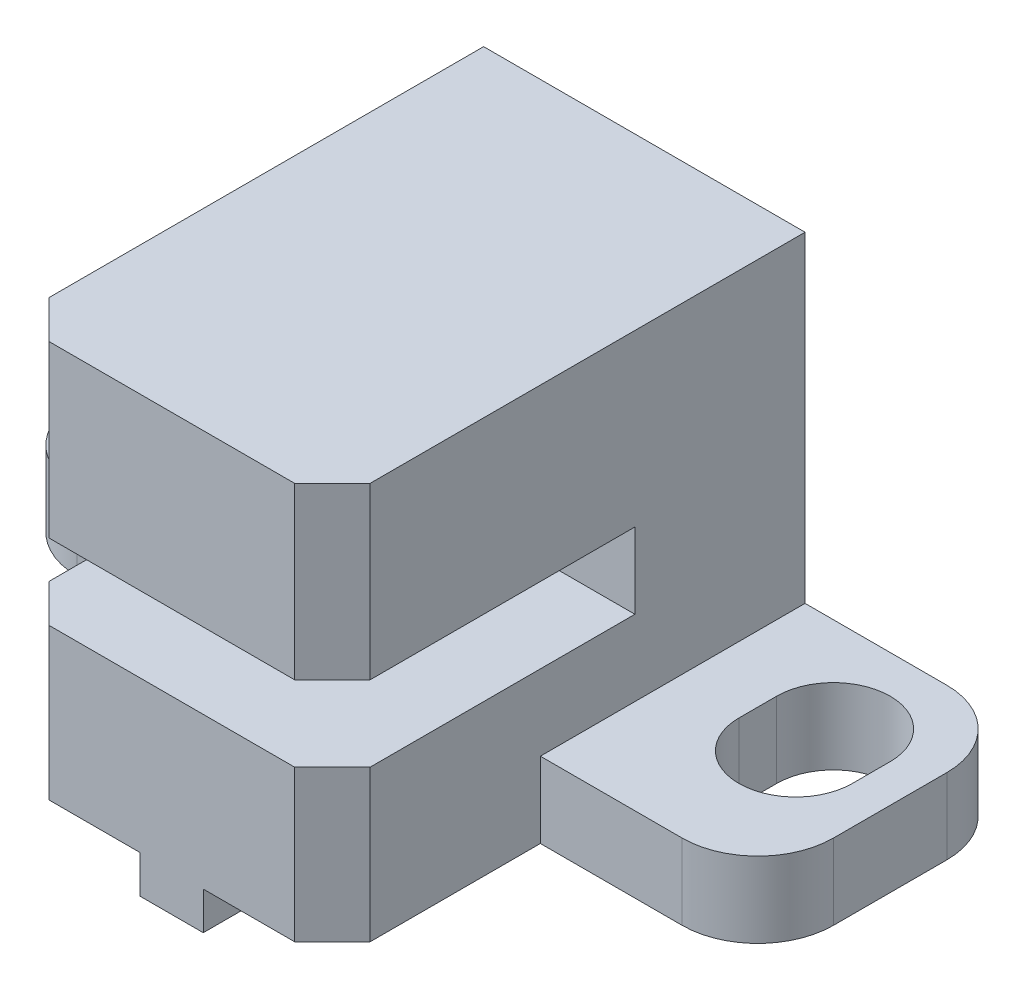
ISO-10303-21;
HEADER;
FILE_DESCRIPTION(('STEP AP214'),'2;1');
FILE_NAME('part.step','',(''),(''),'','','');
FILE_SCHEMA(('AUTOMOTIVE_DESIGN { 1 0 10303 214 1 1 1 1 }'));
ENDSEC;
DATA;
#1=APPLICATION_CONTEXT('core data for automotive mechanical design processes');
#2=APPLICATION_PROTOCOL_DEFINITION('international standard','automotive_design',2000,#1);
#3=PRODUCT_CONTEXT('',#1,'mechanical');
#4=PRODUCT('Part','Part','',(#3));
#5=PRODUCT_RELATED_PRODUCT_CATEGORY('part','',(#4));
#6=PRODUCT_DEFINITION_FORMATION('','',#4);
#7=PRODUCT_DEFINITION_CONTEXT('part definition',#1,'design');
#8=PRODUCT_DEFINITION('design','',#6,#7);
#9=PRODUCT_DEFINITION_SHAPE('','',#8);
#10=(LENGTH_UNIT() NAMED_UNIT(*) SI_UNIT(.MILLI.,.METRE.));
#11=(NAMED_UNIT(*) PLANE_ANGLE_UNIT() SI_UNIT($,.RADIAN.));
#12=(NAMED_UNIT(*) SI_UNIT($,.STERADIAN.) SOLID_ANGLE_UNIT());
#13=UNCERTAINTY_MEASURE_WITH_UNIT(LENGTH_MEASURE(1.E-05),#10,'distance_accuracy_value','');
#14=(GEOMETRIC_REPRESENTATION_CONTEXT(3) GLOBAL_UNCERTAINTY_ASSIGNED_CONTEXT((#13)) GLOBAL_UNIT_ASSIGNED_CONTEXT((#10,
#11,#12)) REPRESENTATION_CONTEXT('',''));
#15=CARTESIAN_POINT('',(0.,0.,0.));
#16=DIRECTION('',(0.,0.,1.));
#17=DIRECTION('',(1.,0.,0.));
#18=AXIS2_PLACEMENT_3D('',#15,#16,#17);
#19=CARTESIAN_POINT('',(-4.25,-5.25,12.5));
#20=DIRECTION('',(0.,1.,0.));
#21=DIRECTION('',(0.,0.,1.));
#22=AXIS2_PLACEMENT_3D('',#19,#20,#21);
#23=PLANE('',#22);
#24=DIRECTION('',(0.,0.,1.));
#25=VECTOR('',#24,1.);
#26=CARTESIAN_POINT('',(9.,-5.25,2.5));
#27=LINE('',#26,#25);
#28=CARTESIAN_POINT('',(9.,-5.25,2.5));
#29=VERTEX_POINT('',#28);
#30=CARTESIAN_POINT('',(9.,-5.25,3.5));
#31=VERTEX_POINT('',#30);
#32=EDGE_CURVE('E412',#29,#31,#27,.T.);
#33=ORIENTED_EDGE('',*,*,#32,.F.);
#34=CARTESIAN_POINT('',(7.5,-5.25,2.5));
#35=DIRECTION('',(0.,-1.,0.));
#36=DIRECTION('',(0.,0.,-1.));
#37=AXIS2_PLACEMENT_3D('',#34,#35,#36);
#38=CIRCLE('',#37,1.5);
#39=CARTESIAN_POINT('',(6.,-5.25,2.5));
#40=VERTEX_POINT('',#39);
#41=EDGE_CURVE('E379',#40,#29,#38,.T.);
#42=ORIENTED_EDGE('',*,*,#41,.F.);
#43=DIRECTION('',(0.,0.,-1.));
#44=VECTOR('',#43,1.);
#45=CARTESIAN_POINT('',(6.,-5.25,2.5));
#46=LINE('',#45,#44);
#47=CARTESIAN_POINT('',(6.,-5.25,3.5));
#48=VERTEX_POINT('',#47);
#49=EDGE_CURVE('E397',#48,#40,#46,.T.);
#50=ORIENTED_EDGE('',*,*,#49,.F.);
#51=CARTESIAN_POINT('',(7.5,-5.25,3.5));
#52=DIRECTION('',(0.,-1.,0.));
#53=DIRECTION('',(0.,0.,-1.));
#54=AXIS2_PLACEMENT_3D('',#51,#52,#53);
#55=CIRCLE('',#54,1.5);
#56=EDGE_CURVE('E416',#31,#48,#55,.T.);
#57=ORIENTED_EDGE('',*,*,#56,.F.);
#58=EDGE_LOOP('',(#33,#42,#50,#57));
#59=FACE_BOUND('',#58,.T.);
#60=DIRECTION('',(0.,0.,1.));
#61=VECTOR('',#60,1.);
#62=CARTESIAN_POINT('',(0.835960491836318,-5.25,0.));
#63=LINE('',#62,#61);
#64=CARTESIAN_POINT('',(0.835960491836318,-5.25,0.));
#65=VERTEX_POINT('',#64);
#66=CARTESIAN_POINT('',(0.835960491836318,-5.25,12.5));
#67=VERTEX_POINT('',#66);
#68=EDGE_CURVE('E55',#65,#67,#63,.T.);
#69=ORIENTED_EDGE('',*,*,#68,.F.);
#70=DIRECTION('',(1.,0.,0.));
#71=VECTOR('',#70,1.);
#72=CARTESIAN_POINT('',(-4.25,-5.25,0.));
#73=LINE('',#72,#71);
#74=CARTESIAN_POINT('',(7.99999999999999,-5.25,0.));
#75=VERTEX_POINT('',#74);
#76=EDGE_CURVE('E552',#65,#75,#73,.T.);
#77=ORIENTED_EDGE('',*,*,#76,.T.);
#78=CARTESIAN_POINT('',(8.,-5.25,2.));
#79=DIRECTION('',(0.,-1.,0.));
#80=DIRECTION('',(0.,0.,1.));
#81=AXIS2_PLACEMENT_3D('',#78,#79,#80);
#82=CIRCLE('',#81,2.);
#83=CARTESIAN_POINT('',(10.,-5.25,2.00000000000001));
#84=VERTEX_POINT('',#83);
#85=EDGE_CURVE('E426',#75,#84,#82,.T.);
#86=ORIENTED_EDGE('',*,*,#85,.T.);
#87=DIRECTION('',(0.,0.,1.));
#88=VECTOR('',#87,1.);
#89=CARTESIAN_POINT('',(10.,-5.25,2.00000000000001));
#90=LINE('',#89,#88);
#91=CARTESIAN_POINT('',(10.,-5.25,4.99999999999999));
#92=VERTEX_POINT('',#91);
#93=EDGE_CURVE('E465',#84,#92,#90,.T.);
#94=ORIENTED_EDGE('',*,*,#93,.T.);
#95=CARTESIAN_POINT('',(8.,-5.25,5.));
#96=DIRECTION('',(0.,-1.,0.));
#97=DIRECTION('',(0.,0.,1.));
#98=AXIS2_PLACEMENT_3D('',#95,#96,#97);
#99=CIRCLE('',#98,2.);
#100=CARTESIAN_POINT('',(7.99999999999999,-5.25,7.));
#101=VERTEX_POINT('',#100);
#102=EDGE_CURVE('E469',#92,#101,#99,.T.);
#103=ORIENTED_EDGE('',*,*,#102,.T.);
#104=DIRECTION('',(-1.,0.,0.));
#105=VECTOR('',#104,1.);
#106=CARTESIAN_POINT('',(4.25,-5.25,7.));
#107=LINE('',#106,#105);
#108=CARTESIAN_POINT('',(4.25,-5.25,7.));
#109=VERTEX_POINT('',#108);
#110=EDGE_CURVE('E441',#101,#109,#107,.T.);
#111=ORIENTED_EDGE('',*,*,#110,.T.);
#112=DIRECTION('',(0.,0.,-1.));
#113=VECTOR('',#112,1.);
#114=CARTESIAN_POINT('',(4.25,-5.25,12.5));
#115=LINE('',#114,#113);
#116=CARTESIAN_POINT('',(4.25,-5.25,11.5));
#117=VERTEX_POINT('',#116);
#118=EDGE_CURVE('E540',#117,#109,#115,.T.);
#119=ORIENTED_EDGE('',*,*,#118,.F.);
#120=DIRECTION('',(-0.707106781186546,0.,0.707106781186549));
#121=VECTOR('',#120,1.);
#122=CARTESIAN_POINT('',(3.25,-5.25,12.5));
#123=LINE('',#122,#121);
#124=CARTESIAN_POINT('',(3.25000000000001,-5.25,12.5));
#125=VERTEX_POINT('',#124);
#126=EDGE_CURVE('E589',#117,#125,#123,.T.);
#127=ORIENTED_EDGE('',*,*,#126,.T.);
#128=DIRECTION('',(1.,0.,0.));
#129=VECTOR('',#128,1.);
#130=CARTESIAN_POINT('',(-4.25,-5.25,12.5));
#131=LINE('',#130,#129);
#132=EDGE_CURVE('E60',#67,#125,#131,.T.);
#133=ORIENTED_EDGE('',*,*,#132,.F.);
#134=EDGE_LOOP('',(#69,#77,#86,#94,#103,#111,#119,#127,#133));
#135=FACE_BOUND('',#134,.T.);
#136=ADVANCED_FACE('F39',(#59,#135),#23,.F.);
#137=CARTESIAN_POINT('',(-7.5,-5.25,2.5));
#138=DIRECTION('',(0.,-1.,0.));
#139=DIRECTION('',(0.,0.,1.));
#140=AXIS2_PLACEMENT_3D('',#137,#138,#139);
#141=CIRCLE('',#140,1.5);
#142=CARTESIAN_POINT('',(-9.,-5.25,2.5));
#143=VERTEX_POINT('',#142);
#144=CARTESIAN_POINT('',(-6.,-5.25,2.5));
#145=VERTEX_POINT('',#144);
#146=EDGE_CURVE('E284',#143,#145,#141,.T.);
#147=ORIENTED_EDGE('',*,*,#146,.F.);
#148=DIRECTION('',(0.,0.,-1.));
#149=VECTOR('',#148,1.);
#150=CARTESIAN_POINT('',(-9.,-5.25,2.5));
#151=LINE('',#150,#149);
#152=CARTESIAN_POINT('',(-9.,-5.25,3.5));
#153=VERTEX_POINT('',#152);
#154=EDGE_CURVE('E299',#153,#143,#151,.T.);
#155=ORIENTED_EDGE('',*,*,#154,.F.);
#156=CARTESIAN_POINT('',(-7.5,-5.25,3.5));
#157=DIRECTION('',(0.,-1.,0.));
#158=DIRECTION('',(0.,0.,1.));
#159=AXIS2_PLACEMENT_3D('',#156,#157,#158);
#160=CIRCLE('',#159,1.5);
#161=CARTESIAN_POINT('',(-6.,-5.25,3.5));
#162=VERTEX_POINT('',#161);
#163=EDGE_CURVE('E315',#162,#153,#160,.T.);
#164=ORIENTED_EDGE('',*,*,#163,.F.);
#165=DIRECTION('',(0.,0.,1.));
#166=VECTOR('',#165,1.);
#167=CARTESIAN_POINT('',(-6.,-5.25,2.5));
#168=LINE('',#167,#166);
#169=EDGE_CURVE('E288',#145,#162,#168,.T.);
#170=ORIENTED_EDGE('',*,*,#169,.F.);
#171=EDGE_LOOP('',(#147,#155,#164,#170));
#172=FACE_BOUND('',#171,.T.);
#173=DIRECTION('',(0.,0.,-1.));
#174=VECTOR('',#173,1.);
#175=CARTESIAN_POINT('',(-0.835960491836315,-5.25,0.));
#176=LINE('',#175,#174);
#177=CARTESIAN_POINT('',(-0.835960491836315,-5.25,12.5));
#178=VERTEX_POINT('',#177);
#179=CARTESIAN_POINT('',(-0.835960491836315,-5.25,0.));
#180=VERTEX_POINT('',#179);
#181=EDGE_CURVE('E280',#178,#180,#176,.T.);
#182=ORIENTED_EDGE('',*,*,#181,.F.);
#183=CARTESIAN_POINT('',(-3.25,-5.25,12.5));
#184=VERTEX_POINT('',#183);
#185=EDGE_CURVE('E537',#184,#178,#131,.T.);
#186=ORIENTED_EDGE('',*,*,#185,.F.);
#187=DIRECTION('',(-0.707106781186546,0.,-0.707106781186549));
#188=VECTOR('',#187,1.);
#189=CARTESIAN_POINT('',(-3.25,-5.25,12.5));
#190=LINE('',#189,#188);
#191=CARTESIAN_POINT('',(-4.25,-5.25,11.5));
#192=VERTEX_POINT('',#191);
#193=EDGE_CURVE('E586',#184,#192,#190,.T.);
#194=ORIENTED_EDGE('',*,*,#193,.T.);
#195=DIRECTION('',(0.,0.,-1.));
#196=VECTOR('',#195,1.);
#197=CARTESIAN_POINT('',(-4.25,-5.25,12.5));
#198=LINE('',#197,#196);
#199=CARTESIAN_POINT('',(-4.25,-5.25,7.));
#200=VERTEX_POINT('',#199);
#201=EDGE_CURVE('E557',#192,#200,#198,.T.);
#202=ORIENTED_EDGE('',*,*,#201,.T.);
#203=DIRECTION('',(-1.,0.,0.));
#204=VECTOR('',#203,1.);
#205=CARTESIAN_POINT('',(-4.25,-5.25,7.));
#206=LINE('',#205,#204);
#207=CARTESIAN_POINT('',(-7.99999999999998,-5.25,7.));
#208=VERTEX_POINT('',#207);
#209=EDGE_CURVE('E325',#200,#208,#206,.T.);
#210=ORIENTED_EDGE('',*,*,#209,.T.);
#211=CARTESIAN_POINT('',(-8.,-5.25,5.));
#212=DIRECTION('',(0.,-1.,0.));
#213=DIRECTION('',(0.,0.,-1.));
#214=AXIS2_PLACEMENT_3D('',#211,#212,#213);
#215=CIRCLE('',#214,2.);
#216=CARTESIAN_POINT('',(-10.,-5.25,4.99999999999999));
#217=VERTEX_POINT('',#216);
#218=EDGE_CURVE('E364',#208,#217,#215,.T.);
#219=ORIENTED_EDGE('',*,*,#218,.T.);
#220=DIRECTION('',(0.,0.,-1.));
#221=VECTOR('',#220,1.);
#222=CARTESIAN_POINT('',(-10.,-5.25,2.00000000000001));
#223=LINE('',#222,#221);
#224=CARTESIAN_POINT('',(-10.,-5.25,2.00000000000001));
#225=VERTEX_POINT('',#224);
#226=EDGE_CURVE('E368',#217,#225,#223,.T.);
#227=ORIENTED_EDGE('',*,*,#226,.T.);
#228=CARTESIAN_POINT('',(-8.,-5.25,2.));
#229=DIRECTION('',(0.,-1.,0.));
#230=DIRECTION('',(0.,0.,1.));
#231=AXIS2_PLACEMENT_3D('',#228,#229,#230);
#232=CIRCLE('',#231,2.);
#233=CARTESIAN_POINT('',(-7.99999999999998,-5.25,0.));
#234=VERTEX_POINT('',#233);
#235=EDGE_CURVE('E340',#225,#234,#232,.T.);
#236=ORIENTED_EDGE('',*,*,#235,.T.);
#237=EDGE_CURVE('E536',#234,#180,#73,.T.);
#238=ORIENTED_EDGE('',*,*,#237,.T.);
#239=EDGE_LOOP('',(#182,#186,#194,#202,#210,#219,#227,#236,#238));
#240=FACE_BOUND('',#239,.T.);
#241=ADVANCED_FACE('F657',(#172,#240),#23,.F.);
#242=CARTESIAN_POINT('',(4.25,5.25,12.5));
#243=DIRECTION('',(-1.,0.,0.));
#244=DIRECTION('',(0.,-1.,0.));
#245=AXIS2_PLACEMENT_3D('',#242,#243,#244);
#246=PLANE('',#245);
#247=DIRECTION('',(0.,0.,1.));
#248=VECTOR('',#247,1.);
#249=CARTESIAN_POINT('',(4.25,-1.25,4.5));
#250=LINE('',#249,#248);
#251=CARTESIAN_POINT('',(4.25,-1.25,4.5));
#252=VERTEX_POINT('',#251);
#253=CARTESIAN_POINT('',(4.25,-1.25,11.5));
#254=VERTEX_POINT('',#253);
#255=EDGE_CURVE('E525',#252,#254,#250,.T.);
#256=ORIENTED_EDGE('',*,*,#255,.T.);
#257=DIRECTION('',(0.,-1.,0.));
#258=VECTOR('',#257,1.);
#259=CARTESIAN_POINT('',(4.25,-5.25,11.5));
#260=LINE('',#259,#258);
#261=EDGE_CURVE('E583',#254,#117,#260,.T.);
#262=ORIENTED_EDGE('',*,*,#261,.T.);
#263=ORIENTED_EDGE('',*,*,#118,.T.);
#264=DIRECTION('',(0.,-1.,0.));
#265=VECTOR('',#264,1.);
#266=CARTESIAN_POINT('',(4.25,-3.25,7.));
#267=LINE('',#266,#265);
#268=CARTESIAN_POINT('',(4.25,-3.25,7.));
#269=VERTEX_POINT('',#268);
#270=EDGE_CURVE('E476',#269,#109,#267,.T.);
#271=ORIENTED_EDGE('',*,*,#270,.F.);
#272=DIRECTION('',(0.,0.,-1.));
#273=VECTOR('',#272,1.);
#274=CARTESIAN_POINT('',(4.25,-3.25,0.));
#275=LINE('',#274,#273);
#276=CARTESIAN_POINT('',(4.25,-3.25,0.));
#277=VERTEX_POINT('',#276);
#278=EDGE_CURVE('E436',#269,#277,#275,.T.);
#279=ORIENTED_EDGE('',*,*,#278,.T.);
#280=DIRECTION('',(0.,1.,0.));
#281=VECTOR('',#280,1.);
#282=CARTESIAN_POINT('',(4.25,5.25,0.));
#283=LINE('',#282,#281);
#284=CARTESIAN_POINT('',(4.25,5.25,0.));
#285=VERTEX_POINT('',#284);
#286=EDGE_CURVE('E520',#277,#285,#283,.T.);
#287=ORIENTED_EDGE('',*,*,#286,.T.);
#288=DIRECTION('',(0.,0.,-1.));
#289=VECTOR('',#288,1.);
#290=CARTESIAN_POINT('',(4.25,5.25,12.5));
#291=LINE('',#290,#289);
#292=CARTESIAN_POINT('',(4.25,5.25,11.5));
#293=VERTEX_POINT('',#292);
#294=EDGE_CURVE('E563',#293,#285,#291,.T.);
#295=ORIENTED_EDGE('',*,*,#294,.F.);
#296=DIRECTION('',(0.,-1.,0.));
#297=VECTOR('',#296,1.);
#298=CARTESIAN_POINT('',(4.25,0.749999999999999,11.5));
#299=LINE('',#298,#297);
#300=CARTESIAN_POINT('',(4.25,0.749999999999999,11.5));
#301=VERTEX_POINT('',#300);
#302=EDGE_CURVE('E580',#293,#301,#299,.T.);
#303=ORIENTED_EDGE('',*,*,#302,.T.);
#304=DIRECTION('',(0.,0.,1.));
#305=VECTOR('',#304,1.);
#306=CARTESIAN_POINT('',(4.25,0.749999999999999,4.5));
#307=LINE('',#306,#305);
#308=CARTESIAN_POINT('',(4.25,0.749999999999999,4.5));
#309=VERTEX_POINT('',#308);
#310=EDGE_CURVE('E521',#309,#301,#307,.T.);
#311=ORIENTED_EDGE('',*,*,#310,.F.);
#312=DIRECTION('',(0.,1.,0.));
#313=VECTOR('',#312,1.);
#314=CARTESIAN_POINT('',(4.25,0.749999999999999,4.5));
#315=LINE('',#314,#313);
#316=EDGE_CURVE('E502',#252,#309,#315,.T.);
#317=ORIENTED_EDGE('',*,*,#316,.F.);
#318=EDGE_LOOP('',(#256,#262,#263,#271,#279,#287,#295,#303,#311,#317));
#319=FACE_BOUND('',#318,.T.);
#320=ADVANCED_FACE('F640',(#319),#246,.F.);
#321=CARTESIAN_POINT('',(0.,0.,12.5));
#322=DIRECTION('',(0.,0.,1.));
#323=DIRECTION('',(1.,0.,0.));
#324=AXIS2_PLACEMENT_3D('',#321,#322,#323);
#325=PLANE('',#324);
#326=DIRECTION('',(-1.,0.,0.));
#327=VECTOR('',#326,1.);
#328=CARTESIAN_POINT('',(-4.25,0.749999999999999,12.5));
#329=LINE('',#328,#327);
#330=CARTESIAN_POINT('',(3.25,0.749999999999999,12.5));
#331=VERTEX_POINT('',#330);
#332=CARTESIAN_POINT('',(-3.25,0.749999999999999,12.5));
#333=VERTEX_POINT('',#332);
#334=EDGE_CURVE('E498',#331,#333,#329,.T.);
#335=ORIENTED_EDGE('',*,*,#334,.F.);
#336=DIRECTION('',(0.,1.,0.));
#337=VECTOR('',#336,1.);
#338=CARTESIAN_POINT('',(3.25,5.25,12.5));
#339=LINE('',#338,#337);
#340=CARTESIAN_POINT('',(3.25,5.25,12.5));
#341=VERTEX_POINT('',#340);
#342=EDGE_CURVE('E596',#331,#341,#339,.T.);
#343=ORIENTED_EDGE('',*,*,#342,.T.);
#344=DIRECTION('',(-1.,0.,0.));
#345=VECTOR('',#344,1.);
#346=CARTESIAN_POINT('',(-4.25,5.25,12.5));
#347=LINE('',#346,#345);
#348=CARTESIAN_POINT('',(-3.25,5.25,12.5));
#349=VERTEX_POINT('',#348);
#350=EDGE_CURVE('E532',#341,#349,#347,.T.);
#351=ORIENTED_EDGE('',*,*,#350,.T.);
#352=DIRECTION('',(0.,-1.,0.));
#353=VECTOR('',#352,1.);
#354=CARTESIAN_POINT('',(-3.25,0.749999999999999,12.5));
#355=LINE('',#354,#353);
#356=EDGE_CURVE('E592',#349,#333,#355,.T.);
#357=ORIENTED_EDGE('',*,*,#356,.T.);
#358=EDGE_LOOP('',(#335,#343,#351,#357));
#359=FACE_BOUND('',#358,.T.);
#360=ADVANCED_FACE('F628',(#359),#325,.T.);
#361=CARTESIAN_POINT('',(-4.25,5.25,12.5));
#362=DIRECTION('',(0.,-1.,0.));
#363=DIRECTION('',(0.,0.,-1.));
#364=AXIS2_PLACEMENT_3D('',#361,#362,#363);
#365=PLANE('',#364);
#366=ORIENTED_EDGE('',*,*,#350,.F.);
#367=DIRECTION('',(0.707106781186546,0.,-0.707106781186549));
#368=VECTOR('',#367,1.);
#369=CARTESIAN_POINT('',(3.25,5.25,12.5));
#370=LINE('',#369,#368);
#371=EDGE_CURVE('E603',#341,#293,#370,.T.);
#372=ORIENTED_EDGE('',*,*,#371,.T.);
#373=ORIENTED_EDGE('',*,*,#294,.T.);
#374=DIRECTION('',(-1.,0.,0.));
#375=VECTOR('',#374,1.);
#376=CARTESIAN_POINT('',(-4.25,5.25,0.));
#377=LINE('',#376,#375);
#378=CARTESIAN_POINT('',(-4.25,5.25,0.));
#379=VERTEX_POINT('',#378);
#380=EDGE_CURVE('E544',#285,#379,#377,.T.);
#381=ORIENTED_EDGE('',*,*,#380,.T.);
#382=DIRECTION('',(0.,0.,-1.));
#383=VECTOR('',#382,1.);
#384=CARTESIAN_POINT('',(-4.25,5.25,12.5));
#385=LINE('',#384,#383);
#386=CARTESIAN_POINT('',(-4.25,5.25,11.5));
#387=VERTEX_POINT('',#386);
#388=EDGE_CURVE('E560',#387,#379,#385,.T.);
#389=ORIENTED_EDGE('',*,*,#388,.F.);
#390=DIRECTION('',(0.707106781186546,0.,0.707106781186549));
#391=VECTOR('',#390,1.);
#392=CARTESIAN_POINT('',(-3.25,5.25,12.5));
#393=LINE('',#392,#391);
#394=EDGE_CURVE('E600',#387,#349,#393,.T.);
#395=ORIENTED_EDGE('',*,*,#394,.T.);
#396=EDGE_LOOP('',(#366,#372,#373,#381,#389,#395));
#397=FACE_BOUND('',#396,.T.);
#398=ADVANCED_FACE('F622',(#397),#365,.F.);
#399=CARTESIAN_POINT('',(-4.25,5.25,12.5));
#400=DIRECTION('',(1.,0.,0.));
#401=DIRECTION('',(0.,1.,0.));
#402=AXIS2_PLACEMENT_3D('',#399,#400,#401);
#403=PLANE('',#402);
#404=ORIENTED_EDGE('',*,*,#201,.F.);
#405=DIRECTION('',(0.,1.,0.));
#406=VECTOR('',#405,1.);
#407=CARTESIAN_POINT('',(-4.25,-1.25,11.5));
#408=LINE('',#407,#406);
#409=CARTESIAN_POINT('',(-4.25,-1.25,11.5));
#410=VERTEX_POINT('',#409);
#411=EDGE_CURVE('E11',#192,#410,#408,.T.);
#412=ORIENTED_EDGE('',*,*,#411,.T.);
#413=DIRECTION('',(0.,0.,1.));
#414=VECTOR('',#413,1.);
#415=CARTESIAN_POINT('',(-4.25,-1.25,4.5));
#416=LINE('',#415,#414);
#417=CARTESIAN_POINT('',(-4.25,-1.25,4.5));
#418=VERTEX_POINT('',#417);
#419=EDGE_CURVE('E509',#418,#410,#416,.T.);
#420=ORIENTED_EDGE('',*,*,#419,.F.);
#421=DIRECTION('',(0.,-1.,0.));
#422=VECTOR('',#421,1.);
#423=CARTESIAN_POINT('',(-4.25,0.749999999999999,4.5));
#424=LINE('',#423,#422);
#425=CARTESIAN_POINT('',(-4.25,0.749999999999999,4.5));
#426=VERTEX_POINT('',#425);
#427=EDGE_CURVE('E493',#426,#418,#424,.T.);
#428=ORIENTED_EDGE('',*,*,#427,.F.);
#429=DIRECTION('',(0.,0.,1.));
#430=VECTOR('',#429,1.);
#431=CARTESIAN_POINT('',(-4.25,0.749999999999999,4.5));
#432=LINE('',#431,#430);
#433=CARTESIAN_POINT('',(-4.25,0.749999999999999,11.5));
#434=VERTEX_POINT('',#433);
#435=EDGE_CURVE('E516',#426,#434,#432,.T.);
#436=ORIENTED_EDGE('',*,*,#435,.T.);
#437=DIRECTION('',(0.,1.,0.));
#438=VECTOR('',#437,1.);
#439=CARTESIAN_POINT('',(-4.25,5.25,11.5));
#440=LINE('',#439,#438);
#441=EDGE_CURVE('E48',#434,#387,#440,.T.);
#442=ORIENTED_EDGE('',*,*,#441,.T.);
#443=ORIENTED_EDGE('',*,*,#388,.T.);
#444=DIRECTION('',(0.,-1.,0.));
#445=VECTOR('',#444,1.);
#446=CARTESIAN_POINT('',(-4.25,5.25,0.));
#447=LINE('',#446,#445);
#448=CARTESIAN_POINT('',(-4.25,-3.25,0.));
#449=VERTEX_POINT('',#448);
#450=EDGE_CURVE('E548',#379,#449,#447,.T.);
#451=ORIENTED_EDGE('',*,*,#450,.T.);
#452=DIRECTION('',(0.,0.,1.));
#453=VECTOR('',#452,1.);
#454=CARTESIAN_POINT('',(-4.25,-3.25,0.));
#455=LINE('',#454,#453);
#456=CARTESIAN_POINT('',(-4.25,-3.25,7.));
#457=VERTEX_POINT('',#456);
#458=EDGE_CURVE('E335',#449,#457,#455,.T.);
#459=ORIENTED_EDGE('',*,*,#458,.T.);
#460=DIRECTION('',(0.,-1.,0.));
#461=VECTOR('',#460,1.);
#462=CARTESIAN_POINT('',(-4.25,-3.25,7.));
#463=LINE('',#462,#461);
#464=EDGE_CURVE('E360',#457,#200,#463,.T.);
#465=ORIENTED_EDGE('',*,*,#464,.T.);
#466=EDGE_LOOP('',(#404,#412,#420,#428,#436,#442,#443,#451,#459,#465));
#467=FACE_BOUND('',#466,.T.);
#468=ADVANCED_FACE('F616',(#467),#403,.F.);
#469=ORIENTED_EDGE('',*,*,#185,.T.);
#470=DIRECTION('',(0.,1.,0.));
#471=VECTOR('',#470,1.);
#472=CARTESIAN_POINT('',(-0.835960491836315,-6.25,12.5));
#473=LINE('',#472,#471);
#474=CARTESIAN_POINT('',(-0.835960491836315,-6.25,12.5));
#475=VERTEX_POINT('',#474);
#476=EDGE_CURVE('E265',#475,#178,#473,.T.);
#477=ORIENTED_EDGE('',*,*,#476,.F.);
#478=DIRECTION('',(-1.,0.,0.));
#479=VECTOR('',#478,1.);
#480=CARTESIAN_POINT('',(-0.835960491836315,-6.25,12.5));
#481=LINE('',#480,#479);
#482=CARTESIAN_POINT('',(0.835960491836318,-6.25,12.5));
#483=VERTEX_POINT('',#482);
#484=EDGE_CURVE('E258',#483,#475,#481,.T.);
#485=ORIENTED_EDGE('',*,*,#484,.F.);
#486=DIRECTION('',(0.,1.,0.));
#487=VECTOR('',#486,1.);
#488=CARTESIAN_POINT('',(0.835960491836318,-6.25,12.5));
#489=LINE('',#488,#487);
#490=EDGE_CURVE('E263',#483,#67,#489,.T.);
#491=ORIENTED_EDGE('',*,*,#490,.T.);
#492=ORIENTED_EDGE('',*,*,#132,.T.);
#493=DIRECTION('',(0.,1.,0.));
#494=VECTOR('',#493,1.);
#495=CARTESIAN_POINT('',(3.25,-1.25,12.5));
#496=LINE('',#495,#494);
#497=CARTESIAN_POINT('',(3.25,-1.25,12.5));
#498=VERTEX_POINT('',#497);
#499=EDGE_CURVE('E570',#125,#498,#496,.T.);
#500=ORIENTED_EDGE('',*,*,#499,.T.);
#501=DIRECTION('',(1.,0.,0.));
#502=VECTOR('',#501,1.);
#503=CARTESIAN_POINT('',(-4.25,-1.25,12.5));
#504=LINE('',#503,#502);
#505=CARTESIAN_POINT('',(-3.25,-1.25,12.5));
#506=VERTEX_POINT('',#505);
#507=EDGE_CURVE('E480',#506,#498,#504,.T.);
#508=ORIENTED_EDGE('',*,*,#507,.F.);
#509=DIRECTION('',(0.,-1.,0.));
#510=VECTOR('',#509,1.);
#511=CARTESIAN_POINT('',(-3.25,-5.25,12.5));
#512=LINE('',#511,#510);
#513=EDGE_CURVE('E566',#506,#184,#512,.T.);
#514=ORIENTED_EDGE('',*,*,#513,.T.);
#515=EDGE_LOOP('',(#469,#477,#485,#491,#492,#500,#508,#514));
#516=FACE_BOUND('',#515,.T.);
#517=ADVANCED_FACE('F261',(#516),#325,.T.);
#518=CARTESIAN_POINT('',(0.,0.,0.));
#519=DIRECTION('',(0.,0.,1.));
#520=DIRECTION('',(1.,0.,0.));
#521=AXIS2_PLACEMENT_3D('',#518,#519,#520);
#522=PLANE('',#521);
#523=ORIENTED_EDGE('',*,*,#286,.F.);
#524=DIRECTION('',(1.,0.,0.));
#525=VECTOR('',#524,1.);
#526=CARTESIAN_POINT('',(4.25,-3.25,0.));
#527=LINE('',#526,#525);
#528=CARTESIAN_POINT('',(7.99999999999999,-3.25,0.));
#529=VERTEX_POINT('',#528);
#530=EDGE_CURVE('E440',#277,#529,#527,.T.);
#531=ORIENTED_EDGE('',*,*,#530,.T.);
#532=DIRECTION('',(0.,-1.,0.));
#533=VECTOR('',#532,1.);
#534=CARTESIAN_POINT('',(7.99999999999999,-3.25,0.));
#535=LINE('',#534,#533);
#536=EDGE_CURVE('E461',#529,#75,#535,.T.);
#537=ORIENTED_EDGE('',*,*,#536,.T.);
#538=ORIENTED_EDGE('',*,*,#76,.F.);
#539=DIRECTION('',(0.,1.,0.));
#540=VECTOR('',#539,1.);
#541=CARTESIAN_POINT('',(0.835960491836318,-6.25,0.));
#542=LINE('',#541,#540);
#543=CARTESIAN_POINT('',(0.835960491836318,-6.25,0.));
#544=VERTEX_POINT('',#543);
#545=EDGE_CURVE('E803',#544,#65,#542,.T.);
#546=ORIENTED_EDGE('',*,*,#545,.F.);
#547=DIRECTION('',(1.,0.,0.));
#548=VECTOR('',#547,1.);
#549=CARTESIAN_POINT('',(-0.835960491836315,-6.25,0.));
#550=LINE('',#549,#548);
#551=CARTESIAN_POINT('',(-0.835960491836315,-6.25,0.));
#552=VERTEX_POINT('',#551);
#553=EDGE_CURVE('E275',#552,#544,#550,.T.);
#554=ORIENTED_EDGE('',*,*,#553,.F.);
#555=DIRECTION('',(0.,1.,0.));
#556=VECTOR('',#555,1.);
#557=CARTESIAN_POINT('',(-0.835960491836315,-6.25,0.));
#558=LINE('',#557,#556);
#559=EDGE_CURVE('E290',#552,#180,#558,.T.);
#560=ORIENTED_EDGE('',*,*,#559,.T.);
#561=ORIENTED_EDGE('',*,*,#237,.F.);
#562=DIRECTION('',(0.,-1.,0.));
#563=VECTOR('',#562,1.);
#564=CARTESIAN_POINT('',(-7.99999999999998,-3.25,0.));
#565=LINE('',#564,#563);
#566=CARTESIAN_POINT('',(-7.99999999999998,-3.25,0.));
#567=VERTEX_POINT('',#566);
#568=EDGE_CURVE('E375',#567,#234,#565,.T.);
#569=ORIENTED_EDGE('',*,*,#568,.F.);
#570=DIRECTION('',(1.,0.,0.));
#571=VECTOR('',#570,1.);
#572=CARTESIAN_POINT('',(-4.25,-3.25,0.));
#573=LINE('',#572,#571);
#574=EDGE_CURVE('E356',#567,#449,#573,.T.);
#575=ORIENTED_EDGE('',*,*,#574,.T.);
#576=ORIENTED_EDGE('',*,*,#450,.F.);
#577=ORIENTED_EDGE('',*,*,#380,.F.);
#578=EDGE_LOOP('',(#523,#531,#537,#538,#546,#554,#560,#561,#569,#575,#576,#577));
#579=FACE_BOUND('',#578,.T.);
#580=ADVANCED_FACE('F644',(#579),#522,.F.);
#581=CARTESIAN_POINT('',(-4.25,0.749999999999999,4.5));
#582=DIRECTION('',(0.,1.,0.));
#583=DIRECTION('',(0.,0.,1.));
#584=AXIS2_PLACEMENT_3D('',#581,#582,#583);
#585=PLANE('',#584);
#586=ORIENTED_EDGE('',*,*,#310,.T.);
#587=DIRECTION('',(-0.707106781186546,0.,0.707106781186549));
#588=VECTOR('',#587,1.);
#589=CARTESIAN_POINT('',(3.25,0.749999999999999,12.5));
#590=LINE('',#589,#588);
#591=EDGE_CURVE('E609',#301,#331,#590,.T.);
#592=ORIENTED_EDGE('',*,*,#591,.T.);
#593=ORIENTED_EDGE('',*,*,#334,.T.);
#594=DIRECTION('',(-0.707106781186546,0.,-0.707106781186549));
#595=VECTOR('',#594,1.);
#596=CARTESIAN_POINT('',(-3.25,0.749999999999999,12.5));
#597=LINE('',#596,#595);
#598=EDGE_CURVE('E606',#333,#434,#597,.T.);
#599=ORIENTED_EDGE('',*,*,#598,.T.);
#600=ORIENTED_EDGE('',*,*,#435,.F.);
#601=DIRECTION('',(-1.,0.,0.));
#602=VECTOR('',#601,1.);
#603=CARTESIAN_POINT('',(-4.25,0.749999999999999,4.5));
#604=LINE('',#603,#602);
#605=EDGE_CURVE('E505',#309,#426,#604,.T.);
#606=ORIENTED_EDGE('',*,*,#605,.F.);
#607=EDGE_LOOP('',(#586,#592,#593,#599,#600,#606));
#608=FACE_BOUND('',#607,.T.);
#609=ADVANCED_FACE('F631',(#608),#585,.F.);
#610=CARTESIAN_POINT('',(-4.25,-1.25,4.5));
#611=DIRECTION('',(0.,-1.,0.));
#612=DIRECTION('',(1.,0.,0.));
#613=AXIS2_PLACEMENT_3D('',#610,#611,#612);
#614=PLANE('',#613);
#615=ORIENTED_EDGE('',*,*,#507,.T.);
#616=DIRECTION('',(0.707106781186546,0.,-0.707106781186549));
#617=VECTOR('',#616,1.);
#618=CARTESIAN_POINT('',(3.25,-1.25,12.5));
#619=LINE('',#618,#617);
#620=EDGE_CURVE('E577',#498,#254,#619,.T.);
#621=ORIENTED_EDGE('',*,*,#620,.T.);
#622=ORIENTED_EDGE('',*,*,#255,.F.);
#623=DIRECTION('',(1.,0.,0.));
#624=VECTOR('',#623,1.);
#625=CARTESIAN_POINT('',(-4.25,-1.25,4.5));
#626=LINE('',#625,#624);
#627=EDGE_CURVE('E497',#418,#252,#626,.T.);
#628=ORIENTED_EDGE('',*,*,#627,.F.);
#629=ORIENTED_EDGE('',*,*,#419,.T.);
#630=DIRECTION('',(0.707106781186546,0.,0.707106781186549));
#631=VECTOR('',#630,1.);
#632=CARTESIAN_POINT('',(-3.25,-1.25,12.5));
#633=LINE('',#632,#631);
#634=EDGE_CURVE('E574',#410,#506,#633,.T.);
#635=ORIENTED_EDGE('',*,*,#634,.T.);
#636=EDGE_LOOP('',(#615,#621,#622,#628,#629,#635));
#637=FACE_BOUND('',#636,.T.);
#638=ADVANCED_FACE('F667',(#637),#614,.F.);
#639=CARTESIAN_POINT('',(0.,0.,4.5));
#640=DIRECTION('',(0.,0.,1.));
#641=DIRECTION('',(1.,0.,0.));
#642=AXIS2_PLACEMENT_3D('',#639,#640,#641);
#643=PLANE('',#642);
#644=ORIENTED_EDGE('',*,*,#427,.T.);
#645=ORIENTED_EDGE('',*,*,#627,.T.);
#646=ORIENTED_EDGE('',*,*,#316,.T.);
#647=ORIENTED_EDGE('',*,*,#605,.T.);
#648=EDGE_LOOP('',(#644,#645,#646,#647));
#649=FACE_BOUND('',#648,.T.);
#650=ADVANCED_FACE('F676',(#649),#643,.T.);
#651=CARTESIAN_POINT('',(4.25,-3.25,7.));
#652=DIRECTION('',(0.,0.,1.));
#653=DIRECTION('',(1.,0.,0.));
#654=AXIS2_PLACEMENT_3D('',#651,#652,#653);
#655=PLANE('',#654);
#656=ORIENTED_EDGE('',*,*,#110,.F.);
#657=DIRECTION('',(0.,-1.,0.));
#658=VECTOR('',#657,1.);
#659=CARTESIAN_POINT('',(7.99999999999999,-3.25,7.));
#660=LINE('',#659,#658);
#661=CARTESIAN_POINT('',(7.99999999999999,-3.25,7.));
#662=VERTEX_POINT('',#661);
#663=EDGE_CURVE('E481',#662,#101,#660,.T.);
#664=ORIENTED_EDGE('',*,*,#663,.F.);
#665=DIRECTION('',(-1.,0.,0.));
#666=VECTOR('',#665,1.);
#667=CARTESIAN_POINT('',(4.25,-3.25,7.));
#668=LINE('',#667,#666);
#669=EDGE_CURVE('E457',#662,#269,#668,.T.);
#670=ORIENTED_EDGE('',*,*,#669,.T.);
#671=ORIENTED_EDGE('',*,*,#270,.T.);
#672=EDGE_LOOP('',(#656,#664,#670,#671));
#673=FACE_BOUND('',#672,.T.);
#674=ADVANCED_FACE('F678',(#673),#655,.T.);
#675=CARTESIAN_POINT('',(8.,-3.25,5.));
#676=DIRECTION('',(0.,-1.,0.));
#677=DIRECTION('',(0.,0.,-1.));
#678=AXIS2_PLACEMENT_3D('',#675,#676,#677);
#679=CYLINDRICAL_SURFACE('',#678,2.);
#680=ORIENTED_EDGE('',*,*,#102,.F.);
#681=DIRECTION('',(0.,-1.,0.));
#682=VECTOR('',#681,1.);
#683=CARTESIAN_POINT('',(10.,-3.25,4.99999999999999));
#684=LINE('',#683,#682);
#685=CARTESIAN_POINT('',(10.,-3.25,4.99999999999999));
#686=VERTEX_POINT('',#685);
#687=EDGE_CURVE('E484',#686,#92,#684,.T.);
#688=ORIENTED_EDGE('',*,*,#687,.F.);
#689=CARTESIAN_POINT('',(8.,-3.25,5.));
#690=DIRECTION('',(0.,-1.,0.));
#691=DIRECTION('',(0.,0.,1.));
#692=AXIS2_PLACEMENT_3D('',#689,#690,#691);
#693=CIRCLE('',#692,2.);
#694=EDGE_CURVE('E453',#686,#662,#693,.T.);
#695=ORIENTED_EDGE('',*,*,#694,.T.);
#696=ORIENTED_EDGE('',*,*,#663,.T.);
#697=EDGE_LOOP('',(#680,#688,#695,#696));
#698=FACE_BOUND('',#697,.T.);
#699=ADVANCED_FACE('F684',(#698),#679,.T.);
#700=CARTESIAN_POINT('',(10.,-3.25,2.00000000000001));
#701=DIRECTION('',(1.,0.,0.));
#702=DIRECTION('',(0.,0.,-1.));
#703=AXIS2_PLACEMENT_3D('',#700,#701,#702);
#704=PLANE('',#703);
#705=ORIENTED_EDGE('',*,*,#93,.F.);
#706=DIRECTION('',(0.,-1.,0.));
#707=VECTOR('',#706,1.);
#708=CARTESIAN_POINT('',(10.,-3.25,2.00000000000001));
#709=LINE('',#708,#707);
#710=CARTESIAN_POINT('',(10.,-3.25,2.00000000000001));
#711=VERTEX_POINT('',#710);
#712=EDGE_CURVE('E487',#711,#84,#709,.T.);
#713=ORIENTED_EDGE('',*,*,#712,.F.);
#714=DIRECTION('',(0.,0.,1.));
#715=VECTOR('',#714,1.);
#716=CARTESIAN_POINT('',(10.,-3.25,2.00000000000001));
#717=LINE('',#716,#715);
#718=EDGE_CURVE('E449',#711,#686,#717,.T.);
#719=ORIENTED_EDGE('',*,*,#718,.T.);
#720=ORIENTED_EDGE('',*,*,#687,.T.);
#721=EDGE_LOOP('',(#705,#713,#719,#720));
#722=FACE_BOUND('',#721,.T.);
#723=ADVANCED_FACE('F784',(#722),#704,.T.);
#724=CARTESIAN_POINT('',(8.,-3.25,2.));
#725=DIRECTION('',(0.,-1.,0.));
#726=DIRECTION('',(0.,0.,-1.));
#727=AXIS2_PLACEMENT_3D('',#724,#725,#726);
#728=CYLINDRICAL_SURFACE('',#727,2.);
#729=ORIENTED_EDGE('',*,*,#85,.F.);
#730=ORIENTED_EDGE('',*,*,#536,.F.);
#731=CARTESIAN_POINT('',(8.,-3.25,2.));
#732=DIRECTION('',(0.,-1.,0.));
#733=DIRECTION('',(0.,0.,1.));
#734=AXIS2_PLACEMENT_3D('',#731,#732,#733);
#735=CIRCLE('',#734,2.);
#736=EDGE_CURVE('E445',#529,#711,#735,.T.);
#737=ORIENTED_EDGE('',*,*,#736,.T.);
#738=ORIENTED_EDGE('',*,*,#712,.T.);
#739=EDGE_LOOP('',(#729,#730,#737,#738));
#740=FACE_BOUND('',#739,.T.);
#741=ADVANCED_FACE('F779',(#740),#728,.T.);
#742=CARTESIAN_POINT('',(8.,-3.25,5.));
#743=DIRECTION('',(0.,1.,0.));
#744=DIRECTION('',(0.,0.,1.));
#745=AXIS2_PLACEMENT_3D('',#742,#743,#744);
#746=PLANE('',#745);
#747=CARTESIAN_POINT('',(7.5,-3.25,2.5));
#748=DIRECTION('',(0.,-1.,0.));
#749=DIRECTION('',(0.,0.,-1.));
#750=AXIS2_PLACEMENT_3D('',#747,#748,#749);
#751=CIRCLE('',#750,1.5);
#752=CARTESIAN_POINT('',(6.,-3.25,2.5));
#753=VERTEX_POINT('',#752);
#754=CARTESIAN_POINT('',(9.,-3.25,2.5));
#755=VERTEX_POINT('',#754);
#756=EDGE_CURVE('E392',#753,#755,#751,.T.);
#757=ORIENTED_EDGE('',*,*,#756,.T.);
#758=DIRECTION('',(0.,0.,1.));
#759=VECTOR('',#758,1.);
#760=CARTESIAN_POINT('',(9.,-3.25,2.5));
#761=LINE('',#760,#759);
#762=CARTESIAN_POINT('',(9.,-3.25,3.5));
#763=VERTEX_POINT('',#762);
#764=EDGE_CURVE('E396',#755,#763,#761,.T.);
#765=ORIENTED_EDGE('',*,*,#764,.T.);
#766=CARTESIAN_POINT('',(7.5,-3.25,3.5));
#767=DIRECTION('',(0.,-1.,0.));
#768=DIRECTION('',(0.,0.,-1.));
#769=AXIS2_PLACEMENT_3D('',#766,#767,#768);
#770=CIRCLE('',#769,1.5);
#771=CARTESIAN_POINT('',(6.,-3.25,3.5));
#772=VERTEX_POINT('',#771);
#773=EDGE_CURVE('E401',#763,#772,#770,.T.);
#774=ORIENTED_EDGE('',*,*,#773,.T.);
#775=DIRECTION('',(0.,0.,-1.));
#776=VECTOR('',#775,1.);
#777=CARTESIAN_POINT('',(6.,-3.25,2.5));
#778=LINE('',#777,#776);
#779=EDGE_CURVE('E405',#772,#753,#778,.T.);
#780=ORIENTED_EDGE('',*,*,#779,.T.);
#781=EDGE_LOOP('',(#757,#765,#774,#780));
#782=FACE_BOUND('',#781,.T.);
#783=ORIENTED_EDGE('',*,*,#278,.F.);
#784=ORIENTED_EDGE('',*,*,#669,.F.);
#785=ORIENTED_EDGE('',*,*,#694,.F.);
#786=ORIENTED_EDGE('',*,*,#718,.F.);
#787=ORIENTED_EDGE('',*,*,#736,.F.);
#788=ORIENTED_EDGE('',*,*,#530,.F.);
#789=EDGE_LOOP('',(#783,#784,#785,#786,#787,#788));
#790=FACE_BOUND('',#789,.T.);
#791=ADVANCED_FACE('F776',(#782,#790),#746,.T.);
#792=CARTESIAN_POINT('',(7.5,-3.25,2.5));
#793=DIRECTION('',(0.,-1.,0.));
#794=DIRECTION('',(0.,0.,-1.));
#795=AXIS2_PLACEMENT_3D('',#792,#793,#794);
#796=CYLINDRICAL_SURFACE('',#795,1.5);
#797=ORIENTED_EDGE('',*,*,#41,.T.);
#798=DIRECTION('',(0.,-1.,0.));
#799=VECTOR('',#798,1.);
#800=CARTESIAN_POINT('',(9.,-3.25,2.5));
#801=LINE('',#800,#799);
#802=EDGE_CURVE('E409',#755,#29,#801,.T.);
#803=ORIENTED_EDGE('',*,*,#802,.F.);
#804=ORIENTED_EDGE('',*,*,#756,.F.);
#805=DIRECTION('',(0.,-1.,0.));
#806=VECTOR('',#805,1.);
#807=CARTESIAN_POINT('',(6.,-3.25,2.5));
#808=LINE('',#807,#806);
#809=EDGE_CURVE('E423',#753,#40,#808,.T.);
#810=ORIENTED_EDGE('',*,*,#809,.T.);
#811=EDGE_LOOP('',(#797,#803,#804,#810));
#812=FACE_BOUND('',#811,.T.);
#813=ADVANCED_FACE('F766',(#812),#796,.F.);
#814=CARTESIAN_POINT('',(6.,-3.25,2.5));
#815=DIRECTION('',(-1.,0.,0.));
#816=DIRECTION('',(0.,0.,1.));
#817=AXIS2_PLACEMENT_3D('',#814,#815,#816);
#818=PLANE('',#817);
#819=ORIENTED_EDGE('',*,*,#49,.T.);
#820=ORIENTED_EDGE('',*,*,#809,.F.);
#821=ORIENTED_EDGE('',*,*,#779,.F.);
#822=DIRECTION('',(0.,-1.,0.));
#823=VECTOR('',#822,1.);
#824=CARTESIAN_POINT('',(6.,-3.25,3.5));
#825=LINE('',#824,#823);
#826=EDGE_CURVE('E427',#772,#48,#825,.T.);
#827=ORIENTED_EDGE('',*,*,#826,.T.);
#828=EDGE_LOOP('',(#819,#820,#821,#827));
#829=FACE_BOUND('',#828,.T.);
#830=ADVANCED_FACE('F762',(#829),#818,.F.);
#831=CARTESIAN_POINT('',(7.5,-3.25,3.5));
#832=DIRECTION('',(0.,-1.,0.));
#833=DIRECTION('',(0.,0.,-1.));
#834=AXIS2_PLACEMENT_3D('',#831,#832,#833);
#835=CYLINDRICAL_SURFACE('',#834,1.5);
#836=ORIENTED_EDGE('',*,*,#56,.T.);
#837=ORIENTED_EDGE('',*,*,#826,.F.);
#838=ORIENTED_EDGE('',*,*,#773,.F.);
#839=DIRECTION('',(0.,-1.,0.));
#840=VECTOR('',#839,1.);
#841=CARTESIAN_POINT('',(9.,-3.25,3.5));
#842=LINE('',#841,#840);
#843=EDGE_CURVE('E430',#763,#31,#842,.T.);
#844=ORIENTED_EDGE('',*,*,#843,.T.);
#845=EDGE_LOOP('',(#836,#837,#838,#844));
#846=FACE_BOUND('',#845,.T.);
#847=ADVANCED_FACE('F765',(#846),#835,.F.);
#848=CARTESIAN_POINT('',(9.,-3.25,2.5));
#849=DIRECTION('',(1.,0.,0.));
#850=DIRECTION('',(0.,0.,-1.));
#851=AXIS2_PLACEMENT_3D('',#848,#849,#850);
#852=PLANE('',#851);
#853=ORIENTED_EDGE('',*,*,#32,.T.);
#854=ORIENTED_EDGE('',*,*,#843,.F.);
#855=ORIENTED_EDGE('',*,*,#764,.F.);
#856=ORIENTED_EDGE('',*,*,#802,.T.);
#857=EDGE_LOOP('',(#853,#854,#855,#856));
#858=FACE_BOUND('',#857,.T.);
#859=ADVANCED_FACE('F751',(#858),#852,.F.);
#860=CARTESIAN_POINT('',(-8.,-3.25,2.));
#861=DIRECTION('',(0.,-1.,0.));
#862=DIRECTION('',(0.,0.,-1.));
#863=AXIS2_PLACEMENT_3D('',#860,#861,#862);
#864=CYLINDRICAL_SURFACE('',#863,2.);
#865=ORIENTED_EDGE('',*,*,#235,.F.);
#866=DIRECTION('',(0.,-1.,0.));
#867=VECTOR('',#866,1.);
#868=CARTESIAN_POINT('',(-10.,-3.25,2.00000000000001));
#869=LINE('',#868,#867);
#870=CARTESIAN_POINT('',(-10.,-3.25,2.00000000000001));
#871=VERTEX_POINT('',#870);
#872=EDGE_CURVE('E380',#871,#225,#869,.T.);
#873=ORIENTED_EDGE('',*,*,#872,.F.);
#874=CARTESIAN_POINT('',(-8.,-3.25,2.));
#875=DIRECTION('',(0.,-1.,0.));
#876=DIRECTION('',(0.,0.,1.));
#877=AXIS2_PLACEMENT_3D('',#874,#875,#876);
#878=CIRCLE('',#877,2.);
#879=EDGE_CURVE('E352',#871,#567,#878,.T.);
#880=ORIENTED_EDGE('',*,*,#879,.T.);
#881=ORIENTED_EDGE('',*,*,#568,.T.);
#882=EDGE_LOOP('',(#865,#873,#880,#881));
#883=FACE_BOUND('',#882,.T.);
#884=ADVANCED_FACE('F747',(#883),#864,.T.);
#885=CARTESIAN_POINT('',(-10.,-3.25,2.00000000000001));
#886=DIRECTION('',(-1.,0.,0.));
#887=DIRECTION('',(0.,0.,1.));
#888=AXIS2_PLACEMENT_3D('',#885,#886,#887);
#889=PLANE('',#888);
#890=ORIENTED_EDGE('',*,*,#226,.F.);
#891=DIRECTION('',(0.,-1.,0.));
#892=VECTOR('',#891,1.);
#893=CARTESIAN_POINT('',(-10.,-3.25,4.99999999999999));
#894=LINE('',#893,#892);
#895=CARTESIAN_POINT('',(-10.,-3.25,4.99999999999999));
#896=VERTEX_POINT('',#895);
#897=EDGE_CURVE('E383',#896,#217,#894,.T.);
#898=ORIENTED_EDGE('',*,*,#897,.F.);
#899=DIRECTION('',(0.,0.,-1.));
#900=VECTOR('',#899,1.);
#901=CARTESIAN_POINT('',(-10.,-3.25,2.00000000000001));
#902=LINE('',#901,#900);
#903=EDGE_CURVE('E348',#896,#871,#902,.T.);
#904=ORIENTED_EDGE('',*,*,#903,.T.);
#905=ORIENTED_EDGE('',*,*,#872,.T.);
#906=EDGE_LOOP('',(#890,#898,#904,#905));
#907=FACE_BOUND('',#906,.T.);
#908=ADVANCED_FACE('F750',(#907),#889,.T.);
#909=CARTESIAN_POINT('',(-8.,-3.25,5.));
#910=DIRECTION('',(0.,-1.,0.));
#911=DIRECTION('',(0.,0.,-1.));
#912=AXIS2_PLACEMENT_3D('',#909,#910,#911);
#913=CYLINDRICAL_SURFACE('',#912,2.);
#914=ORIENTED_EDGE('',*,*,#218,.F.);
#915=DIRECTION('',(0.,-1.,0.));
#916=VECTOR('',#915,1.);
#917=CARTESIAN_POINT('',(-7.99999999999998,-3.25,7.));
#918=LINE('',#917,#916);
#919=CARTESIAN_POINT('',(-7.99999999999998,-3.25,7.));
#920=VERTEX_POINT('',#919);
#921=EDGE_CURVE('E386',#920,#208,#918,.T.);
#922=ORIENTED_EDGE('',*,*,#921,.F.);
#923=CARTESIAN_POINT('',(-8.,-3.25,5.));
#924=DIRECTION('',(0.,-1.,0.));
#925=DIRECTION('',(0.,0.,-1.));
#926=AXIS2_PLACEMENT_3D('',#923,#924,#925);
#927=CIRCLE('',#926,2.);
#928=EDGE_CURVE('E344',#920,#896,#927,.T.);
#929=ORIENTED_EDGE('',*,*,#928,.T.);
#930=ORIENTED_EDGE('',*,*,#897,.T.);
#931=EDGE_LOOP('',(#914,#922,#929,#930));
#932=FACE_BOUND('',#931,.T.);
#933=ADVANCED_FACE('F755',(#932),#913,.T.);
#934=CARTESIAN_POINT('',(-4.25,-3.25,7.));
#935=DIRECTION('',(0.,0.,1.));
#936=DIRECTION('',(1.,0.,0.));
#937=AXIS2_PLACEMENT_3D('',#934,#935,#936);
#938=PLANE('',#937);
#939=ORIENTED_EDGE('',*,*,#209,.F.);
#940=ORIENTED_EDGE('',*,*,#464,.F.);
#941=DIRECTION('',(-1.,0.,0.));
#942=VECTOR('',#941,1.);
#943=CARTESIAN_POINT('',(-4.25,-3.25,7.));
#944=LINE('',#943,#942);
#945=EDGE_CURVE('E339',#457,#920,#944,.T.);
#946=ORIENTED_EDGE('',*,*,#945,.T.);
#947=ORIENTED_EDGE('',*,*,#921,.T.);
#948=EDGE_LOOP('',(#939,#940,#946,#947));
#949=FACE_BOUND('',#948,.T.);
#950=ADVANCED_FACE('F654',(#949),#938,.T.);
#951=CARTESIAN_POINT('',(-8.,-3.25,5.));
#952=DIRECTION('',(0.,-1.,0.));
#953=DIRECTION('',(0.,0.,-1.));
#954=AXIS2_PLACEMENT_3D('',#951,#952,#953);
#955=PLANE('',#954);
#956=DIRECTION('',(0.,0.,-1.));
#957=VECTOR('',#956,1.);
#958=CARTESIAN_POINT('',(-9.,-3.25,2.5));
#959=LINE('',#958,#957);
#960=CARTESIAN_POINT('',(-9.,-3.25,3.5));
#961=VERTEX_POINT('',#960);
#962=CARTESIAN_POINT('',(-9.,-3.25,2.5));
#963=VERTEX_POINT('',#962);
#964=EDGE_CURVE('E307',#961,#963,#959,.T.);
#965=ORIENTED_EDGE('',*,*,#964,.T.);
#966=CARTESIAN_POINT('',(-7.5,-3.25,2.5));
#967=DIRECTION('',(0.,-1.,0.));
#968=DIRECTION('',(0.,0.,1.));
#969=AXIS2_PLACEMENT_3D('',#966,#967,#968);
#970=CIRCLE('',#969,1.5);
#971=CARTESIAN_POINT('',(-6.,-3.25,2.5));
#972=VERTEX_POINT('',#971);
#973=EDGE_CURVE('E294',#963,#972,#970,.T.);
#974=ORIENTED_EDGE('',*,*,#973,.T.);
#975=DIRECTION('',(0.,0.,1.));
#976=VECTOR('',#975,1.);
#977=CARTESIAN_POINT('',(-6.,-3.25,2.5));
#978=LINE('',#977,#976);
#979=CARTESIAN_POINT('',(-6.,-3.25,3.5));
#980=VERTEX_POINT('',#979);
#981=EDGE_CURVE('E298',#972,#980,#978,.T.);
#982=ORIENTED_EDGE('',*,*,#981,.T.);
#983=CARTESIAN_POINT('',(-7.5,-3.25,3.5));
#984=DIRECTION('',(0.,-1.,0.));
#985=DIRECTION('',(0.,0.,1.));
#986=AXIS2_PLACEMENT_3D('',#983,#984,#985);
#987=CIRCLE('',#986,1.5);
#988=EDGE_CURVE('E303',#980,#961,#987,.T.);
#989=ORIENTED_EDGE('',*,*,#988,.T.);
#990=EDGE_LOOP('',(#965,#974,#982,#989));
#991=FACE_BOUND('',#990,.T.);
#992=ORIENTED_EDGE('',*,*,#458,.F.);
#993=ORIENTED_EDGE('',*,*,#574,.F.);
#994=ORIENTED_EDGE('',*,*,#879,.F.);
#995=ORIENTED_EDGE('',*,*,#903,.F.);
#996=ORIENTED_EDGE('',*,*,#928,.F.);
#997=ORIENTED_EDGE('',*,*,#945,.F.);
#998=EDGE_LOOP('',(#992,#993,#994,#995,#996,#997));
#999=FACE_BOUND('',#998,.T.);
#1000=ADVANCED_FACE('F648',(#991,#999),#955,.F.);
#1001=CARTESIAN_POINT('',(-7.5,-3.25,2.5));
#1002=DIRECTION('',(0.,-1.,0.));
#1003=DIRECTION('',(0.,0.,-1.));
#1004=AXIS2_PLACEMENT_3D('',#1001,#1002,#1003);
#1005=CYLINDRICAL_SURFACE('',#1004,1.5);
#1006=ORIENTED_EDGE('',*,*,#146,.T.);
#1007=DIRECTION('',(0.,-1.,0.));
#1008=VECTOR('',#1007,1.);
#1009=CARTESIAN_POINT('',(-6.,-3.25,2.5));
#1010=LINE('',#1009,#1008);
#1011=EDGE_CURVE('E310',#972,#145,#1010,.T.);
#1012=ORIENTED_EDGE('',*,*,#1011,.F.);
#1013=ORIENTED_EDGE('',*,*,#973,.F.);
#1014=DIRECTION('',(0.,-1.,0.));
#1015=VECTOR('',#1014,1.);
#1016=CARTESIAN_POINT('',(-9.,-3.25,2.5));
#1017=LINE('',#1016,#1015);
#1018=EDGE_CURVE('E322',#963,#143,#1017,.T.);
#1019=ORIENTED_EDGE('',*,*,#1018,.T.);
#1020=EDGE_LOOP('',(#1006,#1012,#1013,#1019));
#1021=FACE_BOUND('',#1020,.T.);
#1022=ADVANCED_FACE('F733',(#1021),#1005,.F.);
#1023=CARTESIAN_POINT('',(-9.,-3.25,2.5));
#1024=DIRECTION('',(-1.,0.,0.));
#1025=DIRECTION('',(0.,0.,1.));
#1026=AXIS2_PLACEMENT_3D('',#1023,#1024,#1025);
#1027=PLANE('',#1026);
#1028=ORIENTED_EDGE('',*,*,#154,.T.);
#1029=ORIENTED_EDGE('',*,*,#1018,.F.);
#1030=ORIENTED_EDGE('',*,*,#964,.F.);
#1031=DIRECTION('',(0.,-1.,0.));
#1032=VECTOR('',#1031,1.);
#1033=CARTESIAN_POINT('',(-9.,-3.25,3.5));
#1034=LINE('',#1033,#1032);
#1035=EDGE_CURVE('E326',#961,#153,#1034,.T.);
#1036=ORIENTED_EDGE('',*,*,#1035,.T.);
#1037=EDGE_LOOP('',(#1028,#1029,#1030,#1036));
#1038=FACE_BOUND('',#1037,.T.);
#1039=ADVANCED_FACE('F729',(#1038),#1027,.F.);
#1040=CARTESIAN_POINT('',(-7.5,-3.25,3.5));
#1041=DIRECTION('',(0.,-1.,0.));
#1042=DIRECTION('',(0.,0.,-1.));
#1043=AXIS2_PLACEMENT_3D('',#1040,#1041,#1042);
#1044=CYLINDRICAL_SURFACE('',#1043,1.5);
#1045=ORIENTED_EDGE('',*,*,#163,.T.);
#1046=ORIENTED_EDGE('',*,*,#1035,.F.);
#1047=ORIENTED_EDGE('',*,*,#988,.F.);
#1048=DIRECTION('',(0.,-1.,0.));
#1049=VECTOR('',#1048,1.);
#1050=CARTESIAN_POINT('',(-6.,-3.25,3.5));
#1051=LINE('',#1050,#1049);
#1052=EDGE_CURVE('E329',#980,#162,#1051,.T.);
#1053=ORIENTED_EDGE('',*,*,#1052,.T.);
#1054=EDGE_LOOP('',(#1045,#1046,#1047,#1053));
#1055=FACE_BOUND('',#1054,.T.);
#1056=ADVANCED_FACE('F732',(#1055),#1044,.F.);
#1057=CARTESIAN_POINT('',(-6.,-3.25,2.5));
#1058=DIRECTION('',(1.,0.,0.));
#1059=DIRECTION('',(0.,0.,-1.));
#1060=AXIS2_PLACEMENT_3D('',#1057,#1058,#1059);
#1061=PLANE('',#1060);
#1062=ORIENTED_EDGE('',*,*,#169,.T.);
#1063=ORIENTED_EDGE('',*,*,#1052,.F.);
#1064=ORIENTED_EDGE('',*,*,#981,.F.);
#1065=ORIENTED_EDGE('',*,*,#1011,.T.);
#1066=EDGE_LOOP('',(#1062,#1063,#1064,#1065));
#1067=FACE_BOUND('',#1066,.T.);
#1068=ADVANCED_FACE('F710',(#1067),#1061,.F.);
#1069=CARTESIAN_POINT('',(3.25,0.,12.5));
#1070=DIRECTION('',(0.707106781186549,0.,0.707106781186546));
#1071=DIRECTION('',(0.,-1.,0.));
#1072=AXIS2_PLACEMENT_3D('',#1069,#1070,#1071);
#1073=PLANE('',#1072);
#1074=ORIENTED_EDGE('',*,*,#126,.F.);
#1075=ORIENTED_EDGE('',*,*,#261,.F.);
#1076=ORIENTED_EDGE('',*,*,#620,.F.);
#1077=ORIENTED_EDGE('',*,*,#499,.F.);
#1078=EDGE_LOOP('',(#1074,#1075,#1076,#1077));
#1079=FACE_BOUND('',#1078,.T.);
#1080=ADVANCED_FACE('F671',(#1079),#1073,.T.);
#1081=CARTESIAN_POINT('',(3.25,0.,12.5));
#1082=DIRECTION('',(0.707106781186549,0.,0.707106781186546));
#1083=DIRECTION('',(0.,-1.,0.));
#1084=AXIS2_PLACEMENT_3D('',#1081,#1082,#1083);
#1085=PLANE('',#1084);
#1086=ORIENTED_EDGE('',*,*,#591,.F.);
#1087=ORIENTED_EDGE('',*,*,#302,.F.);
#1088=ORIENTED_EDGE('',*,*,#371,.F.);
#1089=ORIENTED_EDGE('',*,*,#342,.F.);
#1090=EDGE_LOOP('',(#1086,#1087,#1088,#1089));
#1091=FACE_BOUND('',#1090,.T.);
#1092=ADVANCED_FACE('F637',(#1091),#1085,.T.);
#1093=CARTESIAN_POINT('',(-3.25,0.,12.5));
#1094=DIRECTION('',(-0.707106781186549,0.,0.707106781186546));
#1095=DIRECTION('',(0.,1.,0.));
#1096=AXIS2_PLACEMENT_3D('',#1093,#1094,#1095);
#1097=PLANE('',#1096);
#1098=ORIENTED_EDGE('',*,*,#634,.F.);
#1099=ORIENTED_EDGE('',*,*,#411,.F.);
#1100=ORIENTED_EDGE('',*,*,#193,.F.);
#1101=ORIENTED_EDGE('',*,*,#513,.F.);
#1102=EDGE_LOOP('',(#1098,#1099,#1100,#1101));
#1103=FACE_BOUND('',#1102,.T.);
#1104=ADVANCED_FACE('F663',(#1103),#1097,.T.);
#1105=CARTESIAN_POINT('',(-3.25,0.,12.5));
#1106=DIRECTION('',(-0.707106781186549,0.,0.707106781186546));
#1107=DIRECTION('',(0.,1.,0.));
#1108=AXIS2_PLACEMENT_3D('',#1105,#1106,#1107);
#1109=PLANE('',#1108);
#1110=ORIENTED_EDGE('',*,*,#394,.F.);
#1111=ORIENTED_EDGE('',*,*,#441,.F.);
#1112=ORIENTED_EDGE('',*,*,#598,.F.);
#1113=ORIENTED_EDGE('',*,*,#356,.F.);
#1114=EDGE_LOOP('',(#1110,#1111,#1112,#1113));
#1115=FACE_BOUND('',#1114,.T.);
#1116=ADVANCED_FACE('F41',(#1115),#1109,.T.);
#1117=CARTESIAN_POINT('',(0.835960491836318,-6.25,0.));
#1118=DIRECTION('',(-1.,0.,0.));
#1119=DIRECTION('',(0.,0.,1.));
#1120=AXIS2_PLACEMENT_3D('',#1117,#1118,#1119);
#1121=PLANE('',#1120);
#1122=ORIENTED_EDGE('',*,*,#68,.T.);
#1123=ORIENTED_EDGE('',*,*,#490,.F.);
#1124=DIRECTION('',(0.,0.,1.));
#1125=VECTOR('',#1124,1.);
#1126=CARTESIAN_POINT('',(0.835960491836318,-6.25,0.));
#1127=LINE('',#1126,#1125);
#1128=EDGE_CURVE('E270',#544,#483,#1127,.T.);
#1129=ORIENTED_EDGE('',*,*,#1128,.F.);
#1130=ORIENTED_EDGE('',*,*,#545,.T.);
#1131=EDGE_LOOP('',(#1122,#1123,#1129,#1130));
#1132=FACE_BOUND('',#1131,.T.);
#1133=ADVANCED_FACE('F282',(#1132),#1121,.F.);
#1134=CARTESIAN_POINT('',(-0.835960491836315,-6.25,0.));
#1135=DIRECTION('',(1.,0.,0.));
#1136=DIRECTION('',(0.,0.,-1.));
#1137=AXIS2_PLACEMENT_3D('',#1134,#1135,#1136);
#1138=PLANE('',#1137);
#1139=ORIENTED_EDGE('',*,*,#181,.T.);
#1140=ORIENTED_EDGE('',*,*,#559,.F.);
#1141=DIRECTION('',(0.,0.,-1.));
#1142=VECTOR('',#1141,1.);
#1143=CARTESIAN_POINT('',(-0.835960491836315,-6.25,0.));
#1144=LINE('',#1143,#1142);
#1145=EDGE_CURVE('E269',#475,#552,#1144,.T.);
#1146=ORIENTED_EDGE('',*,*,#1145,.F.);
#1147=ORIENTED_EDGE('',*,*,#476,.T.);
#1148=EDGE_LOOP('',(#1139,#1140,#1146,#1147));
#1149=FACE_BOUND('',#1148,.T.);
#1150=ADVANCED_FACE('F719',(#1149),#1138,.F.);
#1151=CARTESIAN_POINT('',(0.,-6.25,0.));
#1152=DIRECTION('',(0.,1.,0.));
#1153=DIRECTION('',(0.,0.,1.));
#1154=AXIS2_PLACEMENT_3D('',#1151,#1152,#1153);
#1155=PLANE('',#1154);
#1156=ORIENTED_EDGE('',*,*,#1128,.T.);
#1157=ORIENTED_EDGE('',*,*,#484,.T.);
#1158=ORIENTED_EDGE('',*,*,#1145,.T.);
#1159=ORIENTED_EDGE('',*,*,#553,.T.);
#1160=EDGE_LOOP('',(#1156,#1157,#1158,#1159));
#1161=FACE_BOUND('',#1160,.T.);
#1162=ADVANCED_FACE('F273',(#1161),#1155,.F.);
#1163=CLOSED_SHELL('',(#136,#241,#320,#360,#398,#468,#517,#580,#609,#638,#650,#674,#699,#723,
#741,#791,#813,#830,#847,#859,#884,#908,#933,#950,#1000,#1022,#1039,#1056,#1068,#1080,#1092,
#1104,#1116,#1133,#1150,#1162));
#1164=MANIFOLD_SOLID_BREP('B2',#1163);
#1165=ADVANCED_BREP_SHAPE_REPRESENTATION('',(#18,#1164),#14);
#1166=SHAPE_DEFINITION_REPRESENTATION(#9,#1165);
ENDSEC;
END-ISO-10303-21;
